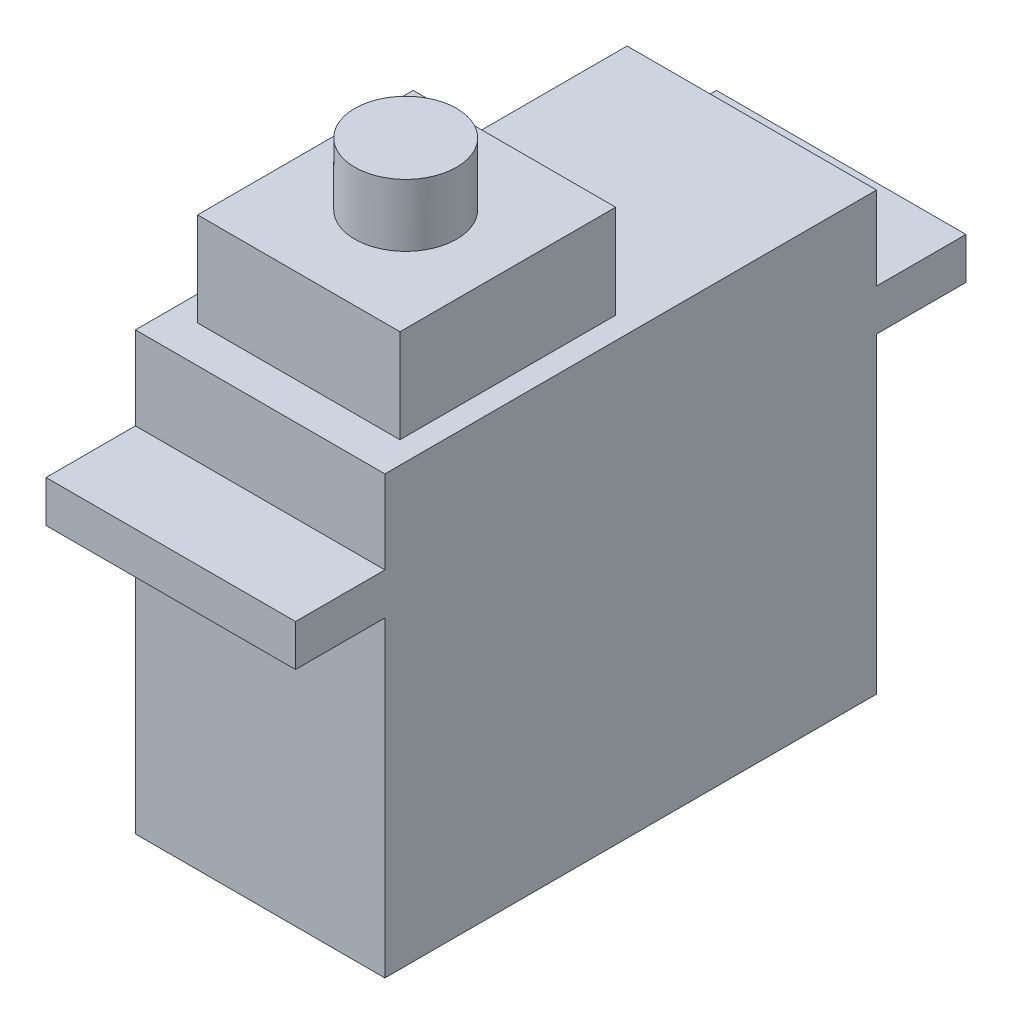
ISO-10303-21;
HEADER;
FILE_DESCRIPTION(('STEP AP214'),'2;1');
FILE_NAME('part.step','',(''),(''),'','','');
FILE_SCHEMA(('AUTOMOTIVE_DESIGN { 1 0 10303 214 1 1 1 1 }'));
ENDSEC;
DATA;
#1=APPLICATION_CONTEXT('core data for automotive mechanical design processes');
#2=APPLICATION_PROTOCOL_DEFINITION('international standard','automotive_design',2000,#1);
#3=PRODUCT_CONTEXT('',#1,'mechanical');
#4=PRODUCT('Part','Part','',(#3));
#5=PRODUCT_RELATED_PRODUCT_CATEGORY('part','',(#4));
#6=PRODUCT_DEFINITION_FORMATION('','',#4);
#7=PRODUCT_DEFINITION_CONTEXT('part definition',#1,'design');
#8=PRODUCT_DEFINITION('design','',#6,#7);
#9=PRODUCT_DEFINITION_SHAPE('','',#8);
#10=(LENGTH_UNIT() NAMED_UNIT(*) SI_UNIT(.MILLI.,.METRE.));
#11=(NAMED_UNIT(*) PLANE_ANGLE_UNIT() SI_UNIT($,.RADIAN.));
#12=(NAMED_UNIT(*) SI_UNIT($,.STERADIAN.) SOLID_ANGLE_UNIT());
#13=UNCERTAINTY_MEASURE_WITH_UNIT(LENGTH_MEASURE(1.E-05),#10,'distance_accuracy_value','');
#14=(GEOMETRIC_REPRESENTATION_CONTEXT(3) GLOBAL_UNCERTAINTY_ASSIGNED_CONTEXT((#13)) GLOBAL_UNIT_ASSIGNED_CONTEXT((#10,
#11,#12)) REPRESENTATION_CONTEXT('',''));
#15=CARTESIAN_POINT('',(0.,0.,0.));
#16=DIRECTION('',(0.,0.,1.));
#17=DIRECTION('',(1.,0.,0.));
#18=AXIS2_PLACEMENT_3D('',#15,#16,#17);
#19=CARTESIAN_POINT('',(6.,6.5,-11.825));
#20=DIRECTION('',(0.,0.,1.));
#21=DIRECTION('',(0.,-1.,0.));
#22=AXIS2_PLACEMENT_3D('',#19,#20,#21);
#23=PLANE('',#22);
#24=DIRECTION('',(0.,1.,0.));
#25=VECTOR('',#24,1.);
#26=CARTESIAN_POINT('',(-6.,6.5,-11.825));
#27=LINE('',#26,#25);
#28=CARTESIAN_POINT('',(-6.,6.5,-11.825));
#29=VERTEX_POINT('',#28);
#30=CARTESIAN_POINT('',(-6.,10.5,-11.825));
#31=VERTEX_POINT('',#30);
#32=EDGE_CURVE('E166',#29,#31,#27,.T.);
#33=ORIENTED_EDGE('',*,*,#32,.T.);
#34=DIRECTION('',(-1.,0.,0.));
#35=VECTOR('',#34,1.);
#36=CARTESIAN_POINT('',(6.,10.5,-11.825));
#37=LINE('',#36,#35);
#38=CARTESIAN_POINT('',(6.,10.5,-11.825));
#39=VERTEX_POINT('',#38);
#40=EDGE_CURVE('E215',#39,#31,#37,.T.);
#41=ORIENTED_EDGE('',*,*,#40,.F.);
#42=DIRECTION('',(0.,1.,0.));
#43=VECTOR('',#42,1.);
#44=CARTESIAN_POINT('',(6.,6.5,-11.825));
#45=LINE('',#44,#43);
#46=CARTESIAN_POINT('',(6.,6.5,-11.825));
#47=VERTEX_POINT('',#46);
#48=EDGE_CURVE('E190',#47,#39,#45,.T.);
#49=ORIENTED_EDGE('',*,*,#48,.F.);
#50=DIRECTION('',(-1.,0.,0.));
#51=VECTOR('',#50,1.);
#52=CARTESIAN_POINT('',(6.,6.5,-11.825));
#53=LINE('',#52,#51);
#54=EDGE_CURVE('E162',#47,#29,#53,.T.);
#55=ORIENTED_EDGE('',*,*,#54,.T.);
#56=EDGE_LOOP('',(#33,#41,#49,#55));
#57=FACE_BOUND('',#56,.T.);
#58=ADVANCED_FACE('F34',(#57),#23,.F.);
#59=CARTESIAN_POINT('',(6.,10.5,11.825));
#60=DIRECTION('',(0.,-1.,0.));
#61=DIRECTION('',(0.,0.,-1.));
#62=AXIS2_PLACEMENT_3D('',#59,#60,#61);
#63=PLANE('',#62);
#64=DIRECTION('',(1.,0.,0.));
#65=VECTOR('',#64,1.);
#66=CARTESIAN_POINT('',(6.,10.5,-0.333204399589612));
#67=LINE('',#66,#65);
#68=CARTESIAN_POINT('',(-4.79550832720638,10.5,-0.333204399589612));
#69=VERTEX_POINT('',#68);
#70=CARTESIAN_POINT('',(4.94002180796765,10.5,-0.333204399589612));
#71=VERTEX_POINT('',#70);
#72=EDGE_CURVE('E223',#69,#71,#67,.T.);
#73=ORIENTED_EDGE('',*,*,#72,.T.);
#74=DIRECTION('',(0.,0.,1.));
#75=VECTOR('',#74,1.);
#76=CARTESIAN_POINT('',(4.94002180796765,10.5,11.825));
#77=LINE('',#76,#75);
#78=CARTESIAN_POINT('',(4.94002180796765,10.5,10.0410195940665));
#79=VERTEX_POINT('',#78);
#80=EDGE_CURVE('E41',#71,#79,#77,.T.);
#81=ORIENTED_EDGE('',*,*,#80,.T.);
#82=DIRECTION('',(-1.,0.,0.));
#83=VECTOR('',#82,1.);
#84=CARTESIAN_POINT('',(6.,10.5,10.0410195940665));
#85=LINE('',#84,#83);
#86=CARTESIAN_POINT('',(-4.79550832720638,10.5,10.0410195940665));
#87=VERTEX_POINT('',#86);
#88=EDGE_CURVE('E217',#79,#87,#85,.T.);
#89=ORIENTED_EDGE('',*,*,#88,.T.);
#90=DIRECTION('',(0.,0.,-1.));
#91=VECTOR('',#90,1.);
#92=CARTESIAN_POINT('',(-4.79550832720638,10.5,11.825));
#93=LINE('',#92,#91);
#94=EDGE_CURVE('E220',#87,#69,#93,.T.);
#95=ORIENTED_EDGE('',*,*,#94,.T.);
#96=EDGE_LOOP('',(#73,#81,#89,#95));
#97=FACE_BOUND('',#96,.T.);
#98=DIRECTION('',(0.,0.,1.));
#99=VECTOR('',#98,1.);
#100=CARTESIAN_POINT('',(-6.,10.5,11.825));
#101=LINE('',#100,#99);
#102=CARTESIAN_POINT('',(-6.,10.5,11.825));
#103=VERTEX_POINT('',#102);
#104=EDGE_CURVE('E169',#31,#103,#101,.T.);
#105=ORIENTED_EDGE('',*,*,#104,.T.);
#106=DIRECTION('',(-1.,0.,0.));
#107=VECTOR('',#106,1.);
#108=CARTESIAN_POINT('',(6.,10.5,11.825));
#109=LINE('',#108,#107);
#110=CARTESIAN_POINT('',(6.,10.5,11.825));
#111=VERTEX_POINT('',#110);
#112=EDGE_CURVE('E212',#111,#103,#109,.T.);
#113=ORIENTED_EDGE('',*,*,#112,.F.);
#114=DIRECTION('',(0.,0.,1.));
#115=VECTOR('',#114,1.);
#116=CARTESIAN_POINT('',(6.,10.5,11.825));
#117=LINE('',#116,#115);
#118=EDGE_CURVE('E111',#39,#111,#117,.T.);
#119=ORIENTED_EDGE('',*,*,#118,.F.);
#120=ORIENTED_EDGE('',*,*,#40,.T.);
#121=EDGE_LOOP('',(#105,#113,#119,#120));
#122=FACE_BOUND('',#121,.T.);
#123=ADVANCED_FACE('F229',(#97,#122),#63,.F.);
#124=CARTESIAN_POINT('',(6.,6.5,11.825));
#125=DIRECTION('',(0.,0.,-1.));
#126=DIRECTION('',(0.,1.,0.));
#127=AXIS2_PLACEMENT_3D('',#124,#125,#126);
#128=PLANE('',#127);
#129=DIRECTION('',(0.,-1.,0.));
#130=VECTOR('',#129,1.);
#131=CARTESIAN_POINT('',(-6.,6.5,11.825));
#132=LINE('',#131,#130);
#133=CARTESIAN_POINT('',(-6.,6.5,11.825));
#134=VERTEX_POINT('',#133);
#135=EDGE_CURVE('E172',#103,#134,#132,.T.);
#136=ORIENTED_EDGE('',*,*,#135,.T.);
#137=DIRECTION('',(-1.,0.,0.));
#138=VECTOR('',#137,1.);
#139=CARTESIAN_POINT('',(6.,6.5,11.825));
#140=LINE('',#139,#138);
#141=CARTESIAN_POINT('',(6.,6.5,11.825));
#142=VERTEX_POINT('',#141);
#143=EDGE_CURVE('E209',#142,#134,#140,.T.);
#144=ORIENTED_EDGE('',*,*,#143,.F.);
#145=DIRECTION('',(0.,-1.,0.));
#146=VECTOR('',#145,1.);
#147=CARTESIAN_POINT('',(6.,6.5,11.825));
#148=LINE('',#147,#146);
#149=EDGE_CURVE('E260',#111,#142,#148,.T.);
#150=ORIENTED_EDGE('',*,*,#149,.F.);
#151=ORIENTED_EDGE('',*,*,#112,.T.);
#152=EDGE_LOOP('',(#136,#144,#150,#151));
#153=FACE_BOUND('',#152,.T.);
#154=ADVANCED_FACE('F292',(#153),#128,.F.);
#155=CARTESIAN_POINT('',(6.,6.5,16.125));
#156=DIRECTION('',(0.,-1.,0.));
#157=DIRECTION('',(0.,0.,-1.));
#158=AXIS2_PLACEMENT_3D('',#155,#156,#157);
#159=PLANE('',#158);
#160=DIRECTION('',(0.,0.,1.));
#161=VECTOR('',#160,1.);
#162=CARTESIAN_POINT('',(-6.,6.5,16.125));
#163=LINE('',#162,#161);
#164=CARTESIAN_POINT('',(-6.,6.5,16.125));
#165=VERTEX_POINT('',#164);
#166=EDGE_CURVE('E174',#134,#165,#163,.T.);
#167=ORIENTED_EDGE('',*,*,#166,.T.);
#168=DIRECTION('',(-1.,0.,0.));
#169=VECTOR('',#168,1.);
#170=CARTESIAN_POINT('',(6.,6.5,16.125));
#171=LINE('',#170,#169);
#172=CARTESIAN_POINT('',(6.,6.5,16.125));
#173=VERTEX_POINT('',#172);
#174=EDGE_CURVE('E206',#173,#165,#171,.T.);
#175=ORIENTED_EDGE('',*,*,#174,.F.);
#176=DIRECTION('',(0.,0.,1.));
#177=VECTOR('',#176,1.);
#178=CARTESIAN_POINT('',(6.,6.5,16.125));
#179=LINE('',#178,#177);
#180=EDGE_CURVE('E262',#142,#173,#179,.T.);
#181=ORIENTED_EDGE('',*,*,#180,.F.);
#182=ORIENTED_EDGE('',*,*,#143,.T.);
#183=EDGE_LOOP('',(#167,#175,#181,#182));
#184=FACE_BOUND('',#183,.T.);
#185=ADVANCED_FACE('F297',(#184),#159,.F.);
#186=CARTESIAN_POINT('',(6.,4.5,16.125));
#187=DIRECTION('',(0.,0.,-1.));
#188=DIRECTION('',(-1.,0.,0.));
#189=AXIS2_PLACEMENT_3D('',#186,#187,#188);
#190=PLANE('',#189);
#191=DIRECTION('',(0.,-1.,0.));
#192=VECTOR('',#191,1.);
#193=CARTESIAN_POINT('',(-6.,4.5,16.125));
#194=LINE('',#193,#192);
#195=CARTESIAN_POINT('',(-6.,4.5,16.125));
#196=VERTEX_POINT('',#195);
#197=EDGE_CURVE('E176',#165,#196,#194,.T.);
#198=ORIENTED_EDGE('',*,*,#197,.T.);
#199=DIRECTION('',(-1.,0.,0.));
#200=VECTOR('',#199,1.);
#201=CARTESIAN_POINT('',(6.,4.5,16.125));
#202=LINE('',#201,#200);
#203=CARTESIAN_POINT('',(6.,4.5,16.125));
#204=VERTEX_POINT('',#203);
#205=EDGE_CURVE('E203',#204,#196,#202,.T.);
#206=ORIENTED_EDGE('',*,*,#205,.F.);
#207=DIRECTION('',(0.,-1.,0.));
#208=VECTOR('',#207,1.);
#209=CARTESIAN_POINT('',(6.,4.5,16.125));
#210=LINE('',#209,#208);
#211=EDGE_CURVE('E264',#173,#204,#210,.T.);
#212=ORIENTED_EDGE('',*,*,#211,.F.);
#213=ORIENTED_EDGE('',*,*,#174,.T.);
#214=EDGE_LOOP('',(#198,#206,#212,#213));
#215=FACE_BOUND('',#214,.T.);
#216=ADVANCED_FACE('F303',(#215),#190,.F.);
#217=CARTESIAN_POINT('',(6.,4.5,16.125));
#218=DIRECTION('',(0.,1.,0.));
#219=DIRECTION('',(0.,0.,1.));
#220=AXIS2_PLACEMENT_3D('',#217,#218,#219);
#221=PLANE('',#220);
#222=DIRECTION('',(0.,0.,-1.));
#223=VECTOR('',#222,1.);
#224=CARTESIAN_POINT('',(-6.,4.5,16.125));
#225=LINE('',#224,#223);
#226=CARTESIAN_POINT('',(-6.,4.5,11.825));
#227=VERTEX_POINT('',#226);
#228=EDGE_CURVE('E178',#196,#227,#225,.T.);
#229=ORIENTED_EDGE('',*,*,#228,.T.);
#230=DIRECTION('',(-1.,0.,0.));
#231=VECTOR('',#230,1.);
#232=CARTESIAN_POINT('',(6.,4.5,11.825));
#233=LINE('',#232,#231);
#234=CARTESIAN_POINT('',(6.,4.5,11.825));
#235=VERTEX_POINT('',#234);
#236=EDGE_CURVE('E200',#235,#227,#233,.T.);
#237=ORIENTED_EDGE('',*,*,#236,.F.);
#238=DIRECTION('',(0.,0.,-1.));
#239=VECTOR('',#238,1.);
#240=CARTESIAN_POINT('',(6.,4.5,16.125));
#241=LINE('',#240,#239);
#242=EDGE_CURVE('E266',#204,#235,#241,.T.);
#243=ORIENTED_EDGE('',*,*,#242,.F.);
#244=ORIENTED_EDGE('',*,*,#205,.T.);
#245=EDGE_LOOP('',(#229,#237,#243,#244));
#246=FACE_BOUND('',#245,.T.);
#247=ADVANCED_FACE('F307',(#246),#221,.F.);
#248=CARTESIAN_POINT('',(6.,-10.5,11.825));
#249=DIRECTION('',(0.,0.,-1.));
#250=DIRECTION('',(-1.,0.,0.));
#251=AXIS2_PLACEMENT_3D('',#248,#249,#250);
#252=PLANE('',#251);
#253=DIRECTION('',(0.,-1.,0.));
#254=VECTOR('',#253,1.);
#255=CARTESIAN_POINT('',(-6.,-10.5,11.825));
#256=LINE('',#255,#254);
#257=CARTESIAN_POINT('',(-6.,-10.5,11.825));
#258=VERTEX_POINT('',#257);
#259=EDGE_CURVE('E180',#227,#258,#256,.T.);
#260=ORIENTED_EDGE('',*,*,#259,.T.);
#261=DIRECTION('',(-1.,0.,0.));
#262=VECTOR('',#261,1.);
#263=CARTESIAN_POINT('',(6.,-10.5,11.825));
#264=LINE('',#263,#262);
#265=CARTESIAN_POINT('',(6.,-10.5,11.825));
#266=VERTEX_POINT('',#265);
#267=EDGE_CURVE('E197',#266,#258,#264,.T.);
#268=ORIENTED_EDGE('',*,*,#267,.F.);
#269=DIRECTION('',(0.,-1.,0.));
#270=VECTOR('',#269,1.);
#271=CARTESIAN_POINT('',(6.,-10.5,11.825));
#272=LINE('',#271,#270);
#273=EDGE_CURVE('E268',#235,#266,#272,.T.);
#274=ORIENTED_EDGE('',*,*,#273,.F.);
#275=ORIENTED_EDGE('',*,*,#236,.T.);
#276=EDGE_LOOP('',(#260,#268,#274,#275));
#277=FACE_BOUND('',#276,.T.);
#278=ADVANCED_FACE('F310',(#277),#252,.F.);
#279=CARTESIAN_POINT('',(6.,-10.5,11.825));
#280=DIRECTION('',(0.,1.,0.));
#281=DIRECTION('',(0.,0.,1.));
#282=AXIS2_PLACEMENT_3D('',#279,#280,#281);
#283=PLANE('',#282);
#284=DIRECTION('',(0.,0.,-1.));
#285=VECTOR('',#284,1.);
#286=CARTESIAN_POINT('',(-6.,-10.5,11.825));
#287=LINE('',#286,#285);
#288=CARTESIAN_POINT('',(-6.,-10.5,-11.825));
#289=VERTEX_POINT('',#288);
#290=EDGE_CURVE('E182',#258,#289,#287,.T.);
#291=ORIENTED_EDGE('',*,*,#290,.T.);
#292=DIRECTION('',(-1.,0.,0.));
#293=VECTOR('',#292,1.);
#294=CARTESIAN_POINT('',(6.,-10.5,-11.825));
#295=LINE('',#294,#293);
#296=CARTESIAN_POINT('',(6.,-10.5,-11.825));
#297=VERTEX_POINT('',#296);
#298=EDGE_CURVE('E194',#297,#289,#295,.T.);
#299=ORIENTED_EDGE('',*,*,#298,.F.);
#300=DIRECTION('',(0.,0.,-1.));
#301=VECTOR('',#300,1.);
#302=CARTESIAN_POINT('',(6.,-10.5,11.825));
#303=LINE('',#302,#301);
#304=EDGE_CURVE('E270',#266,#297,#303,.T.);
#305=ORIENTED_EDGE('',*,*,#304,.F.);
#306=ORIENTED_EDGE('',*,*,#267,.T.);
#307=EDGE_LOOP('',(#291,#299,#305,#306));
#308=FACE_BOUND('',#307,.T.);
#309=ADVANCED_FACE('F276',(#308),#283,.F.);
#310=CARTESIAN_POINT('',(6.,-10.5,-11.825));
#311=DIRECTION('',(0.,0.,1.));
#312=DIRECTION('',(1.,0.,0.));
#313=AXIS2_PLACEMENT_3D('',#310,#311,#312);
#314=PLANE('',#313);
#315=DIRECTION('',(0.,1.,0.));
#316=VECTOR('',#315,1.);
#317=CARTESIAN_POINT('',(-6.,-10.5,-11.825));
#318=LINE('',#317,#316);
#319=CARTESIAN_POINT('',(-6.,4.5,-11.825));
#320=VERTEX_POINT('',#319);
#321=EDGE_CURVE('E184',#289,#320,#318,.T.);
#322=ORIENTED_EDGE('',*,*,#321,.T.);
#323=DIRECTION('',(-1.,0.,0.));
#324=VECTOR('',#323,1.);
#325=CARTESIAN_POINT('',(6.,4.5,-11.825));
#326=LINE('',#325,#324);
#327=CARTESIAN_POINT('',(6.,4.5,-11.825));
#328=VERTEX_POINT('',#327);
#329=EDGE_CURVE('E157',#328,#320,#326,.T.);
#330=ORIENTED_EDGE('',*,*,#329,.F.);
#331=DIRECTION('',(0.,1.,0.));
#332=VECTOR('',#331,1.);
#333=CARTESIAN_POINT('',(6.,-10.5,-11.825));
#334=LINE('',#333,#332);
#335=EDGE_CURVE('E145',#297,#328,#334,.T.);
#336=ORIENTED_EDGE('',*,*,#335,.F.);
#337=ORIENTED_EDGE('',*,*,#298,.T.);
#338=EDGE_LOOP('',(#322,#330,#336,#337));
#339=FACE_BOUND('',#338,.T.);
#340=ADVANCED_FACE('F280',(#339),#314,.F.);
#341=CARTESIAN_POINT('',(6.,4.5,-11.825));
#342=DIRECTION('',(0.,1.,0.));
#343=DIRECTION('',(0.,0.,1.));
#344=AXIS2_PLACEMENT_3D('',#341,#342,#343);
#345=PLANE('',#344);
#346=DIRECTION('',(0.,0.,-1.));
#347=VECTOR('',#346,1.);
#348=CARTESIAN_POINT('',(-6.,4.5,-11.825));
#349=LINE('',#348,#347);
#350=CARTESIAN_POINT('',(-6.,4.5,-16.125));
#351=VERTEX_POINT('',#350);
#352=EDGE_CURVE('E154',#320,#351,#349,.T.);
#353=ORIENTED_EDGE('',*,*,#352,.T.);
#354=DIRECTION('',(-1.,0.,0.));
#355=VECTOR('',#354,1.);
#356=CARTESIAN_POINT('',(6.,4.5,-16.125));
#357=LINE('',#356,#355);
#358=CARTESIAN_POINT('',(6.,4.5,-16.125));
#359=VERTEX_POINT('',#358);
#360=EDGE_CURVE('E151',#359,#351,#357,.T.);
#361=ORIENTED_EDGE('',*,*,#360,.F.);
#362=DIRECTION('',(0.,0.,-1.));
#363=VECTOR('',#362,1.);
#364=CARTESIAN_POINT('',(6.,4.5,-11.825));
#365=LINE('',#364,#363);
#366=EDGE_CURVE('E138',#328,#359,#365,.T.);
#367=ORIENTED_EDGE('',*,*,#366,.F.);
#368=ORIENTED_EDGE('',*,*,#329,.T.);
#369=EDGE_LOOP('',(#353,#361,#367,#368));
#370=FACE_BOUND('',#369,.T.);
#371=ADVANCED_FACE('F152',(#370),#345,.F.);
#372=CARTESIAN_POINT('',(6.,4.5,-16.125));
#373=DIRECTION('',(0.,0.,1.));
#374=DIRECTION('',(1.,0.,0.));
#375=AXIS2_PLACEMENT_3D('',#372,#373,#374);
#376=PLANE('',#375);
#377=DIRECTION('',(0.,1.,0.));
#378=VECTOR('',#377,1.);
#379=CARTESIAN_POINT('',(-6.,4.5,-16.125));
#380=LINE('',#379,#378);
#381=CARTESIAN_POINT('',(-6.,6.5,-16.125));
#382=VERTEX_POINT('',#381);
#383=EDGE_CURVE('E187',#351,#382,#380,.T.);
#384=ORIENTED_EDGE('',*,*,#383,.T.);
#385=DIRECTION('',(-1.,0.,0.));
#386=VECTOR('',#385,1.);
#387=CARTESIAN_POINT('',(6.,6.5,-16.125));
#388=LINE('',#387,#386);
#389=CARTESIAN_POINT('',(6.,6.5,-16.125));
#390=VERTEX_POINT('',#389);
#391=EDGE_CURVE('E158',#390,#382,#388,.T.);
#392=ORIENTED_EDGE('',*,*,#391,.F.);
#393=DIRECTION('',(0.,1.,0.));
#394=VECTOR('',#393,1.);
#395=CARTESIAN_POINT('',(6.,4.5,-16.125));
#396=LINE('',#395,#394);
#397=EDGE_CURVE('E142',#359,#390,#396,.T.);
#398=ORIENTED_EDGE('',*,*,#397,.F.);
#399=ORIENTED_EDGE('',*,*,#360,.T.);
#400=EDGE_LOOP('',(#384,#392,#398,#399));
#401=FACE_BOUND('',#400,.T.);
#402=ADVANCED_FACE('F160',(#401),#376,.F.);
#403=CARTESIAN_POINT('',(6.,6.5,-11.825));
#404=DIRECTION('',(0.,-1.,0.));
#405=DIRECTION('',(0.,0.,-1.));
#406=AXIS2_PLACEMENT_3D('',#403,#404,#405);
#407=PLANE('',#406);
#408=DIRECTION('',(0.,0.,1.));
#409=VECTOR('',#408,1.);
#410=CARTESIAN_POINT('',(-6.,6.5,-11.825));
#411=LINE('',#410,#409);
#412=EDGE_CURVE('E102',#382,#29,#411,.T.);
#413=ORIENTED_EDGE('',*,*,#412,.T.);
#414=ORIENTED_EDGE('',*,*,#54,.F.);
#415=DIRECTION('',(0.,0.,1.));
#416=VECTOR('',#415,1.);
#417=CARTESIAN_POINT('',(6.,6.5,-11.825));
#418=LINE('',#417,#416);
#419=EDGE_CURVE('E57',#390,#47,#418,.T.);
#420=ORIENTED_EDGE('',*,*,#419,.F.);
#421=ORIENTED_EDGE('',*,*,#391,.T.);
#422=EDGE_LOOP('',(#413,#414,#420,#421));
#423=FACE_BOUND('',#422,.T.);
#424=ADVANCED_FACE('F284',(#423),#407,.F.);
#425=CARTESIAN_POINT('',(6.,0.,0.));
#426=DIRECTION('',(-1.,0.,0.));
#427=DIRECTION('',(0.,0.,1.));
#428=AXIS2_PLACEMENT_3D('',#425,#426,#427);
#429=PLANE('',#428);
#430=ORIENTED_EDGE('',*,*,#48,.T.);
#431=ORIENTED_EDGE('',*,*,#118,.T.);
#432=ORIENTED_EDGE('',*,*,#149,.T.);
#433=ORIENTED_EDGE('',*,*,#180,.T.);
#434=ORIENTED_EDGE('',*,*,#211,.T.);
#435=ORIENTED_EDGE('',*,*,#242,.T.);
#436=ORIENTED_EDGE('',*,*,#273,.T.);
#437=ORIENTED_EDGE('',*,*,#304,.T.);
#438=ORIENTED_EDGE('',*,*,#335,.T.);
#439=ORIENTED_EDGE('',*,*,#366,.T.);
#440=ORIENTED_EDGE('',*,*,#397,.T.);
#441=ORIENTED_EDGE('',*,*,#419,.T.);
#442=EDGE_LOOP('',(#430,#431,#432,#433,#434,#435,#436,#437,#438,#439,#440,#441));
#443=FACE_BOUND('',#442,.T.);
#444=ADVANCED_FACE('F140',(#443),#429,.F.);
#445=CARTESIAN_POINT('',(-6.,0.,0.));
#446=DIRECTION('',(-1.,0.,0.));
#447=DIRECTION('',(0.,0.,1.));
#448=AXIS2_PLACEMENT_3D('',#445,#446,#447);
#449=PLANE('',#448);
#450=ORIENTED_EDGE('',*,*,#32,.F.);
#451=ORIENTED_EDGE('',*,*,#412,.F.);
#452=ORIENTED_EDGE('',*,*,#383,.F.);
#453=ORIENTED_EDGE('',*,*,#352,.F.);
#454=ORIENTED_EDGE('',*,*,#321,.F.);
#455=ORIENTED_EDGE('',*,*,#290,.F.);
#456=ORIENTED_EDGE('',*,*,#259,.F.);
#457=ORIENTED_EDGE('',*,*,#228,.F.);
#458=ORIENTED_EDGE('',*,*,#197,.F.);
#459=ORIENTED_EDGE('',*,*,#166,.F.);
#460=ORIENTED_EDGE('',*,*,#135,.F.);
#461=ORIENTED_EDGE('',*,*,#104,.F.);
#462=EDGE_LOOP('',(#450,#451,#452,#453,#454,#455,#456,#457,#458,#459,#460,#461));
#463=FACE_BOUND('',#462,.T.);
#464=ADVANCED_FACE('F283',(#463),#449,.T.);
#465=CARTESIAN_POINT('',(4.94002180796765,15.,16.125));
#466=DIRECTION('',(1.,0.,0.));
#467=DIRECTION('',(0.,0.,-1.));
#468=AXIS2_PLACEMENT_3D('',#465,#466,#467);
#469=PLANE('',#468);
#470=ORIENTED_EDGE('',*,*,#80,.F.);
#471=DIRECTION('',(0.,-1.,0.));
#472=VECTOR('',#471,1.);
#473=CARTESIAN_POINT('',(4.94002180796765,15.,-0.333204399589612));
#474=LINE('',#473,#472);
#475=CARTESIAN_POINT('',(4.94002180796765,15.,-0.333204399589612));
#476=VERTEX_POINT('',#475);
#477=EDGE_CURVE('E170',#476,#71,#474,.T.);
#478=ORIENTED_EDGE('',*,*,#477,.F.);
#479=DIRECTION('',(0.,0.,1.));
#480=VECTOR('',#479,1.);
#481=CARTESIAN_POINT('',(4.94002180796765,15.,16.125));
#482=LINE('',#481,#480);
#483=CARTESIAN_POINT('',(4.94002180796765,15.,10.0410195940665));
#484=VERTEX_POINT('',#483);
#485=EDGE_CURVE('E475',#476,#484,#482,.T.);
#486=ORIENTED_EDGE('',*,*,#485,.T.);
#487=DIRECTION('',(0.,-1.,0.));
#488=VECTOR('',#487,1.);
#489=CARTESIAN_POINT('',(4.94002180796765,15.,10.0410195940665));
#490=LINE('',#489,#488);
#491=EDGE_CURVE('E242',#484,#79,#490,.T.);
#492=ORIENTED_EDGE('',*,*,#491,.T.);
#493=EDGE_LOOP('',(#470,#478,#486,#492));
#494=FACE_BOUND('',#493,.T.);
#495=ADVANCED_FACE('F238',(#494),#469,.T.);
#496=CARTESIAN_POINT('',(6.,15.,-0.333204399589612));
#497=DIRECTION('',(0.,0.,-1.));
#498=DIRECTION('',(-1.,0.,0.));
#499=AXIS2_PLACEMENT_3D('',#496,#497,#498);
#500=PLANE('',#499);
#501=ORIENTED_EDGE('',*,*,#72,.F.);
#502=DIRECTION('',(0.,-1.,0.));
#503=VECTOR('',#502,1.);
#504=CARTESIAN_POINT('',(-4.79550832720638,15.,-0.333204399589612));
#505=LINE('',#504,#503);
#506=CARTESIAN_POINT('',(-4.79550832720638,15.,-0.333204399589612));
#507=VERTEX_POINT('',#506);
#508=EDGE_CURVE('E250',#507,#69,#505,.T.);
#509=ORIENTED_EDGE('',*,*,#508,.F.);
#510=DIRECTION('',(1.,0.,0.));
#511=VECTOR('',#510,1.);
#512=CARTESIAN_POINT('',(6.,15.,-0.333204399589612));
#513=LINE('',#512,#511);
#514=EDGE_CURVE('E249',#507,#476,#513,.T.);
#515=ORIENTED_EDGE('',*,*,#514,.T.);
#516=ORIENTED_EDGE('',*,*,#477,.T.);
#517=EDGE_LOOP('',(#501,#509,#515,#516));
#518=FACE_BOUND('',#517,.T.);
#519=ADVANCED_FACE('F245',(#518),#500,.T.);
#520=CARTESIAN_POINT('',(-4.79550832720638,15.,16.125));
#521=DIRECTION('',(-1.,0.,0.));
#522=DIRECTION('',(0.,0.,1.));
#523=AXIS2_PLACEMENT_3D('',#520,#521,#522);
#524=PLANE('',#523);
#525=ORIENTED_EDGE('',*,*,#94,.F.);
#526=DIRECTION('',(0.,-1.,0.));
#527=VECTOR('',#526,1.);
#528=CARTESIAN_POINT('',(-4.79550832720638,15.,10.0410195940665));
#529=LINE('',#528,#527);
#530=CARTESIAN_POINT('',(-4.79550832720638,15.,10.0410195940665));
#531=VERTEX_POINT('',#530);
#532=EDGE_CURVE('E48',#531,#87,#529,.T.);
#533=ORIENTED_EDGE('',*,*,#532,.F.);
#534=DIRECTION('',(0.,0.,-1.));
#535=VECTOR('',#534,1.);
#536=CARTESIAN_POINT('',(-4.79550832720638,15.,16.125));
#537=LINE('',#536,#535);
#538=EDGE_CURVE('E480',#531,#507,#537,.T.);
#539=ORIENTED_EDGE('',*,*,#538,.T.);
#540=ORIENTED_EDGE('',*,*,#508,.T.);
#541=EDGE_LOOP('',(#525,#533,#539,#540));
#542=FACE_BOUND('',#541,.T.);
#543=ADVANCED_FACE('F420',(#542),#524,.T.);
#544=CARTESIAN_POINT('',(6.,15.,10.0410195940665));
#545=DIRECTION('',(0.,0.,1.));
#546=DIRECTION('',(1.,0.,0.));
#547=AXIS2_PLACEMENT_3D('',#544,#545,#546);
#548=PLANE('',#547);
#549=ORIENTED_EDGE('',*,*,#88,.F.);
#550=ORIENTED_EDGE('',*,*,#491,.F.);
#551=DIRECTION('',(-1.,0.,0.));
#552=VECTOR('',#551,1.);
#553=CARTESIAN_POINT('',(6.,15.,10.0410195940665));
#554=LINE('',#553,#552);
#555=EDGE_CURVE('E477',#484,#531,#554,.T.);
#556=ORIENTED_EDGE('',*,*,#555,.T.);
#557=ORIENTED_EDGE('',*,*,#532,.T.);
#558=EDGE_LOOP('',(#549,#550,#556,#557));
#559=FACE_BOUND('',#558,.T.);
#560=ADVANCED_FACE('F429',(#559),#548,.T.);
#561=CARTESIAN_POINT('',(0.,15.,0.));
#562=DIRECTION('',(0.,-1.,0.));
#563=DIRECTION('',(0.,0.,-1.));
#564=AXIS2_PLACEMENT_3D('',#561,#562,#563);
#565=PLANE('',#564);
#566=CARTESIAN_POINT('',(0.,15.,4.825));
#567=DIRECTION('',(0.,-1.,0.));
#568=DIRECTION('',(0.,0.,-1.));
#569=AXIS2_PLACEMENT_3D('',#566,#567,#568);
#570=CIRCLE('',#569,2.45);
#571=CARTESIAN_POINT('',(0.,15.,2.375));
#572=VERTEX_POINT('',#571);
#573=EDGE_CURVE('E11',#572,#572,#570,.F.);
#574=ORIENTED_EDGE('',*,*,#573,.F.);
#575=EDGE_LOOP('',(#574));
#576=FACE_BOUND('',#575,.T.);
#577=ORIENTED_EDGE('',*,*,#485,.F.);
#578=ORIENTED_EDGE('',*,*,#514,.F.);
#579=ORIENTED_EDGE('',*,*,#538,.F.);
#580=ORIENTED_EDGE('',*,*,#555,.F.);
#581=EDGE_LOOP('',(#577,#578,#579,#580));
#582=FACE_BOUND('',#581,.T.);
#583=ADVANCED_FACE('F439',(#576,#582),#565,.F.);
#584=CARTESIAN_POINT('',(0.,18.,4.825));
#585=DIRECTION('',(0.,-1.,0.));
#586=DIRECTION('',(0.,0.,-1.));
#587=AXIS2_PLACEMENT_3D('',#584,#585,#586);
#588=CYLINDRICAL_SURFACE('',#587,2.45);
#589=CARTESIAN_POINT('',(0.,18.,4.825));
#590=DIRECTION('',(0.,1.,0.));
#591=DIRECTION('',(0.,0.,1.));
#592=AXIS2_PLACEMENT_3D('',#589,#590,#591);
#593=CIRCLE('',#592,2.45);
#594=CARTESIAN_POINT('',(0.,18.,7.275));
#595=VERTEX_POINT('',#594);
#596=EDGE_CURVE('E474',#595,#595,#593,.T.);
#597=ORIENTED_EDGE('',*,*,#596,.F.);
#598=EDGE_LOOP('',(#597));
#599=FACE_BOUND('',#598,.T.);
#600=ORIENTED_EDGE('',*,*,#573,.T.);
#601=EDGE_LOOP('',(#600));
#602=FACE_BOUND('',#601,.T.);
#603=ADVANCED_FACE('F448',(#599,#602),#588,.T.);
#604=CARTESIAN_POINT('',(0.,18.,4.825));
#605=DIRECTION('',(0.,1.,0.));
#606=DIRECTION('',(0.,0.,1.));
#607=AXIS2_PLACEMENT_3D('',#604,#605,#606);
#608=PLANE('',#607);
#609=ORIENTED_EDGE('',*,*,#596,.T.);
#610=EDGE_LOOP('',(#609));
#611=FACE_BOUND('',#610,.T.);
#612=ADVANCED_FACE('F458',(#611),#608,.T.);
#613=CLOSED_SHELL('',(#58,#123,#154,#185,#216,#247,#278,#309,#340,#371,#402,#424,#444,#464,#495,
#519,#543,#560,#583,#603,#612));
#614=MANIFOLD_SOLID_BREP('B2',#613);
#615=ADVANCED_BREP_SHAPE_REPRESENTATION('',(#18,#614),#14);
#616=SHAPE_DEFINITION_REPRESENTATION(#9,#615);
ENDSEC;
END-ISO-10303-21;
